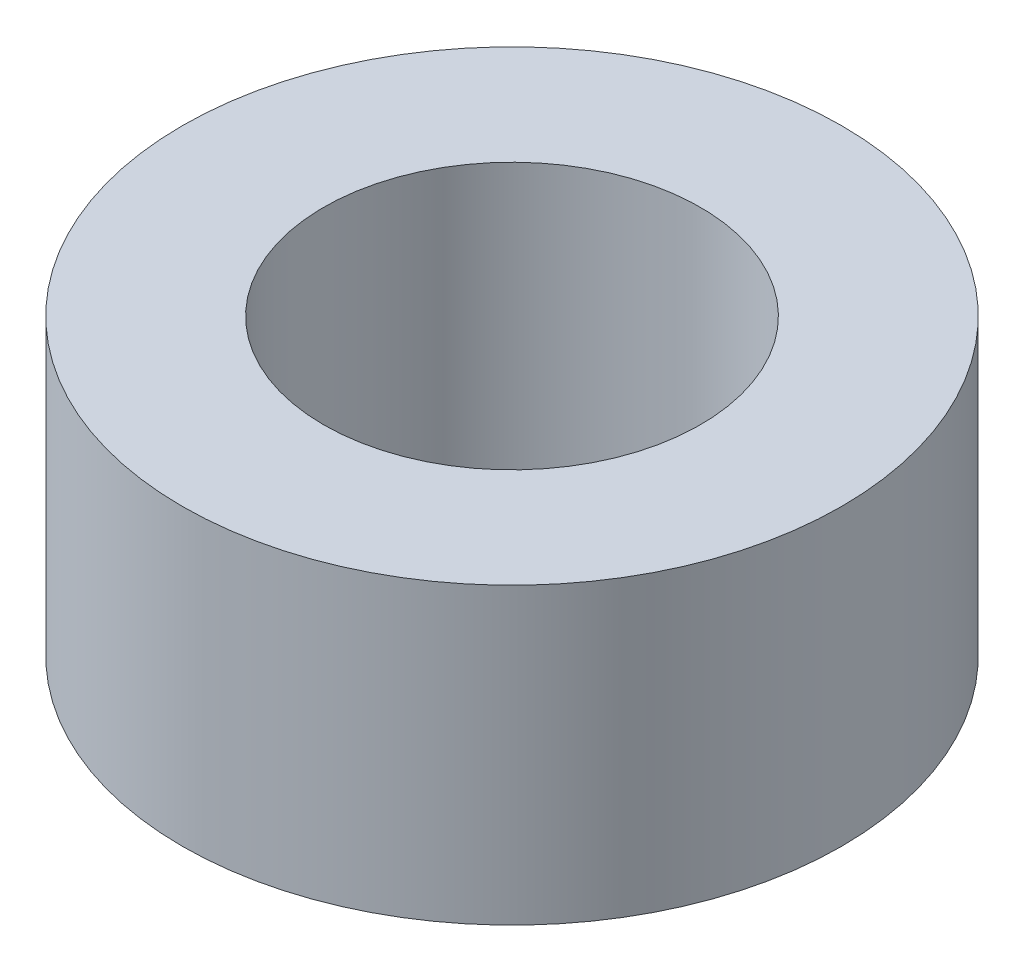
ISO-10303-21;
HEADER;
FILE_DESCRIPTION(('STEP AP214'),'2;1');
FILE_NAME('part.step','',(''),(''),'','','');
FILE_SCHEMA(('AUTOMOTIVE_DESIGN { 1 0 10303 214 1 1 1 1 }'));
ENDSEC;
DATA;
#1=APPLICATION_CONTEXT('core data for automotive mechanical design processes');
#2=APPLICATION_PROTOCOL_DEFINITION('international standard','automotive_design',2000,#1);
#3=PRODUCT_CONTEXT('',#1,'mechanical');
#4=PRODUCT('Part','Part','',(#3));
#5=PRODUCT_RELATED_PRODUCT_CATEGORY('part','',(#4));
#6=PRODUCT_DEFINITION_FORMATION('','',#4);
#7=PRODUCT_DEFINITION_CONTEXT('part definition',#1,'design');
#8=PRODUCT_DEFINITION('design','',#6,#7);
#9=PRODUCT_DEFINITION_SHAPE('','',#8);
#10=(LENGTH_UNIT() NAMED_UNIT(*) SI_UNIT(.MILLI.,.METRE.));
#11=(NAMED_UNIT(*) PLANE_ANGLE_UNIT() SI_UNIT($,.RADIAN.));
#12=(NAMED_UNIT(*) SI_UNIT($,.STERADIAN.) SOLID_ANGLE_UNIT());
#13=UNCERTAINTY_MEASURE_WITH_UNIT(LENGTH_MEASURE(1.E-05),#10,'distance_accuracy_value','');
#14=(GEOMETRIC_REPRESENTATION_CONTEXT(3) GLOBAL_UNCERTAINTY_ASSIGNED_CONTEXT((#13)) GLOBAL_UNIT_ASSIGNED_CONTEXT((#10,
#11,#12)) REPRESENTATION_CONTEXT('',''));
#15=CARTESIAN_POINT('',(0.,0.,0.));
#16=DIRECTION('',(0.,0.,1.));
#17=DIRECTION('',(1.,0.,0.));
#18=AXIS2_PLACEMENT_3D('',#15,#16,#17);
#19=CARTESIAN_POINT('',(0.,25.,0.));
#20=DIRECTION('',(0.,1.,0.));
#21=DIRECTION('',(0.,0.,1.));
#22=AXIS2_PLACEMENT_3D('',#19,#20,#21);
#23=PLANE('',#22);
#24=CARTESIAN_POINT('',(0.,25.,0.));
#25=DIRECTION('',(0.,1.,0.));
#26=DIRECTION('',(0.,0.,1.));
#27=AXIS2_PLACEMENT_3D('',#24,#25,#26);
#28=CIRCLE('',#27,28.);
#29=CARTESIAN_POINT('',(0.,25.,28.));
#30=VERTEX_POINT('',#29);
#31=EDGE_CURVE('E10',#30,#30,#28,.T.);
#32=ORIENTED_EDGE('',*,*,#31,.T.);
#33=EDGE_LOOP('',(#32));
#34=FACE_BOUND('',#33,.T.);
#35=CARTESIAN_POINT('',(0.,25.,0.));
#36=DIRECTION('',(0.,1.,0.));
#37=DIRECTION('',(0.,0.,1.));
#38=AXIS2_PLACEMENT_3D('',#35,#36,#37);
#39=CIRCLE('',#38,16.);
#40=CARTESIAN_POINT('',(0.,25.,16.));
#41=VERTEX_POINT('',#40);
#42=EDGE_CURVE('E41',#41,#41,#39,.T.);
#43=ORIENTED_EDGE('',*,*,#42,.F.);
#44=EDGE_LOOP('',(#43));
#45=FACE_BOUND('',#44,.T.);
#46=ADVANCED_FACE('F30',(#34,#45),#23,.T.);
#47=CARTESIAN_POINT('',(0.,0.,0.));
#48=DIRECTION('',(0.,1.,0.));
#49=DIRECTION('',(0.,0.,1.));
#50=AXIS2_PLACEMENT_3D('',#47,#48,#49);
#51=PLANE('',#50);
#52=CARTESIAN_POINT('',(0.,0.,0.));
#53=DIRECTION('',(0.,1.,0.));
#54=DIRECTION('',(0.,0.,1.));
#55=AXIS2_PLACEMENT_3D('',#52,#53,#54);
#56=CIRCLE('',#55,28.);
#57=CARTESIAN_POINT('',(0.,0.,28.));
#58=VERTEX_POINT('',#57);
#59=EDGE_CURVE('E34',#58,#58,#56,.T.);
#60=ORIENTED_EDGE('',*,*,#59,.F.);
#61=EDGE_LOOP('',(#60));
#62=FACE_BOUND('',#61,.T.);
#63=CARTESIAN_POINT('',(0.,0.,0.));
#64=DIRECTION('',(0.,1.,0.));
#65=DIRECTION('',(0.,0.,1.));
#66=AXIS2_PLACEMENT_3D('',#63,#64,#65);
#67=CIRCLE('',#66,16.);
#68=CARTESIAN_POINT('',(0.,0.,16.));
#69=VERTEX_POINT('',#68);
#70=EDGE_CURVE('E43',#69,#69,#67,.T.);
#71=ORIENTED_EDGE('',*,*,#70,.T.);
#72=EDGE_LOOP('',(#71));
#73=FACE_BOUND('',#72,.T.);
#74=ADVANCED_FACE('F53',(#62,#73),#51,.F.);
#75=CARTESIAN_POINT('',(0.,25.,0.));
#76=DIRECTION('',(0.,-1.,0.));
#77=DIRECTION('',(0.,0.,-1.));
#78=AXIS2_PLACEMENT_3D('',#75,#76,#77);
#79=CYLINDRICAL_SURFACE('',#78,28.);
#80=ORIENTED_EDGE('',*,*,#31,.F.);
#81=EDGE_LOOP('',(#80));
#82=FACE_BOUND('',#81,.T.);
#83=ORIENTED_EDGE('',*,*,#59,.T.);
#84=EDGE_LOOP('',(#83));
#85=FACE_BOUND('',#84,.T.);
#86=ADVANCED_FACE('F32',(#82,#85),#79,.T.);
#87=CARTESIAN_POINT('',(0.,25.,0.));
#88=DIRECTION('',(0.,-1.,0.));
#89=DIRECTION('',(0.,0.,-1.));
#90=AXIS2_PLACEMENT_3D('',#87,#88,#89);
#91=CYLINDRICAL_SURFACE('',#90,16.);
#92=ORIENTED_EDGE('',*,*,#42,.T.);
#93=EDGE_LOOP('',(#92));
#94=FACE_BOUND('',#93,.T.);
#95=ORIENTED_EDGE('',*,*,#70,.F.);
#96=EDGE_LOOP('',(#95));
#97=FACE_BOUND('',#96,.T.);
#98=ADVANCED_FACE('F49',(#94,#97),#91,.F.);
#99=CLOSED_SHELL('',(#46,#74,#86,#98));
#100=MANIFOLD_SOLID_BREP('B2',#99);
#101=ADVANCED_BREP_SHAPE_REPRESENTATION('',(#18,#100),#14);
#102=SHAPE_DEFINITION_REPRESENTATION(#9,#101);
ENDSEC;
END-ISO-10303-21;
